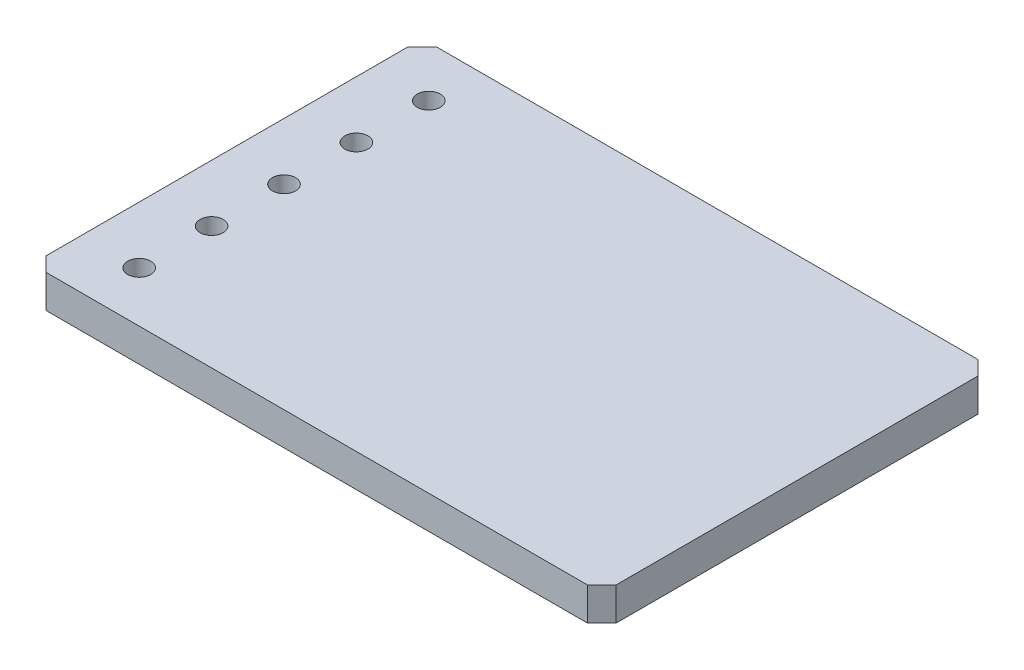
ISO-10303-21;
HEADER;
FILE_DESCRIPTION(('STEP AP214'),'2;1');
FILE_NAME('part.step','',(''),(''),'','','');
FILE_SCHEMA(('AUTOMOTIVE_DESIGN { 1 0 10303 214 1 1 1 1 }'));
ENDSEC;
DATA;
#1=APPLICATION_CONTEXT('core data for automotive mechanical design processes');
#2=APPLICATION_PROTOCOL_DEFINITION('international standard','automotive_design',2000,#1);
#3=PRODUCT_CONTEXT('',#1,'mechanical');
#4=PRODUCT('Part','Part','',(#3));
#5=PRODUCT_RELATED_PRODUCT_CATEGORY('part','',(#4));
#6=PRODUCT_DEFINITION_FORMATION('','',#4);
#7=PRODUCT_DEFINITION_CONTEXT('part definition',#1,'design');
#8=PRODUCT_DEFINITION('design','',#6,#7);
#9=PRODUCT_DEFINITION_SHAPE('','',#8);
#10=(LENGTH_UNIT() NAMED_UNIT(*) SI_UNIT(.MILLI.,.METRE.));
#11=(NAMED_UNIT(*) PLANE_ANGLE_UNIT() SI_UNIT($,.RADIAN.));
#12=(NAMED_UNIT(*) SI_UNIT($,.STERADIAN.) SOLID_ANGLE_UNIT());
#13=UNCERTAINTY_MEASURE_WITH_UNIT(LENGTH_MEASURE(1.E-05),#10,'distance_accuracy_value','');
#14=(GEOMETRIC_REPRESENTATION_CONTEXT(3) GLOBAL_UNCERTAINTY_ASSIGNED_CONTEXT((#13)) GLOBAL_UNIT_ASSIGNED_CONTEXT((#10,
#11,#12)) REPRESENTATION_CONTEXT('',''));
#15=CARTESIAN_POINT('',(0.,0.,0.));
#16=DIRECTION('',(0.,0.,1.));
#17=DIRECTION('',(1.,0.,0.));
#18=AXIS2_PLACEMENT_3D('',#15,#16,#17);
#19=CARTESIAN_POINT('',(-10.,1.16,0.));
#20=DIRECTION('',(-1.,0.,0.));
#21=DIRECTION('',(0.,0.,1.));
#22=AXIS2_PLACEMENT_3D('',#19,#20,#21);
#23=PLANE('',#22);
#24=DIRECTION('',(0.,0.,-1.));
#25=VECTOR('',#24,1.);
#26=CARTESIAN_POINT('',(-10.,1.16,0.));
#27=LINE('',#26,#25);
#28=CARTESIAN_POINT('',(-10.,1.16,6.35));
#29=VERTEX_POINT('',#28);
#30=CARTESIAN_POINT('',(-10.,1.16,-6.35));
#31=VERTEX_POINT('',#30);
#32=EDGE_CURVE('E188',#29,#31,#27,.T.);
#33=ORIENTED_EDGE('',*,*,#32,.T.);
#34=DIRECTION('',(0.,-1.,0.));
#35=VECTOR('',#34,1.);
#36=CARTESIAN_POINT('',(-10.,0.,-6.35));
#37=LINE('',#36,#35);
#38=CARTESIAN_POINT('',(-10.,0.,-6.35));
#39=VERTEX_POINT('',#38);
#40=EDGE_CURVE('E125',#31,#39,#37,.T.);
#41=ORIENTED_EDGE('',*,*,#40,.T.);
#42=DIRECTION('',(0.,0.,-1.));
#43=VECTOR('',#42,1.);
#44=CARTESIAN_POINT('',(-10.,0.,0.));
#45=LINE('',#44,#43);
#46=CARTESIAN_POINT('',(-10.,0.,6.35));
#47=VERTEX_POINT('',#46);
#48=EDGE_CURVE('E116',#47,#39,#45,.T.);
#49=ORIENTED_EDGE('',*,*,#48,.F.);
#50=DIRECTION('',(0.,1.,0.));
#51=VECTOR('',#50,1.);
#52=CARTESIAN_POINT('',(-10.,1.16,6.35));
#53=LINE('',#52,#51);
#54=EDGE_CURVE('E130',#47,#29,#53,.T.);
#55=ORIENTED_EDGE('',*,*,#54,.T.);
#56=EDGE_LOOP('',(#33,#41,#49,#55));
#57=FACE_BOUND('',#56,.T.);
#58=ADVANCED_FACE('F45',(#57),#23,.T.);
#59=CARTESIAN_POINT('',(0.,1.16,6.85));
#60=DIRECTION('',(0.,0.,1.));
#61=DIRECTION('',(1.,0.,0.));
#62=AXIS2_PLACEMENT_3D('',#59,#60,#61);
#63=PLANE('',#62);
#64=DIRECTION('',(-1.,0.,0.));
#65=VECTOR('',#64,1.);
#66=CARTESIAN_POINT('',(0.,0.,6.85));
#67=LINE('',#66,#65);
#68=CARTESIAN_POINT('',(9.5,0.,6.85));
#69=VERTEX_POINT('',#68);
#70=CARTESIAN_POINT('',(-9.5,0.,6.85));
#71=VERTEX_POINT('',#70);
#72=EDGE_CURVE('E118',#69,#71,#67,.T.);
#73=ORIENTED_EDGE('',*,*,#72,.F.);
#74=DIRECTION('',(0.,1.,0.));
#75=VECTOR('',#74,1.);
#76=CARTESIAN_POINT('',(9.5,1.16,6.85));
#77=LINE('',#76,#75);
#78=CARTESIAN_POINT('',(9.5,1.16,6.85));
#79=VERTEX_POINT('',#78);
#80=EDGE_CURVE('E11',#69,#79,#77,.T.);
#81=ORIENTED_EDGE('',*,*,#80,.T.);
#82=DIRECTION('',(-1.,0.,0.));
#83=VECTOR('',#82,1.);
#84=CARTESIAN_POINT('',(0.,1.16,6.85));
#85=LINE('',#84,#83);
#86=CARTESIAN_POINT('',(-9.5,1.16,6.85));
#87=VERTEX_POINT('',#86);
#88=EDGE_CURVE('E186',#79,#87,#85,.T.);
#89=ORIENTED_EDGE('',*,*,#88,.T.);
#90=DIRECTION('',(0.,-1.,0.));
#91=VECTOR('',#90,1.);
#92=CARTESIAN_POINT('',(-9.5,1.16,6.85));
#93=LINE('',#92,#91);
#94=EDGE_CURVE('E55',#87,#71,#93,.T.);
#95=ORIENTED_EDGE('',*,*,#94,.T.);
#96=EDGE_LOOP('',(#73,#81,#89,#95));
#97=FACE_BOUND('',#96,.T.);
#98=ADVANCED_FACE('F184',(#97),#63,.T.);
#99=CARTESIAN_POINT('',(10.,1.16,0.));
#100=DIRECTION('',(-1.,0.,0.));
#101=DIRECTION('',(0.,0.,1.));
#102=AXIS2_PLACEMENT_3D('',#99,#100,#101);
#103=PLANE('',#102);
#104=DIRECTION('',(0.,0.,-1.));
#105=VECTOR('',#104,1.);
#106=CARTESIAN_POINT('',(10.,0.,0.));
#107=LINE('',#106,#105);
#108=CARTESIAN_POINT('',(10.,0.,6.35));
#109=VERTEX_POINT('',#108);
#110=CARTESIAN_POINT('',(10.,0.,-6.35));
#111=VERTEX_POINT('',#110);
#112=EDGE_CURVE('E217',#109,#111,#107,.T.);
#113=ORIENTED_EDGE('',*,*,#112,.T.);
#114=DIRECTION('',(0.,1.,0.));
#115=VECTOR('',#114,1.);
#116=CARTESIAN_POINT('',(10.,1.16,-6.35));
#117=LINE('',#116,#115);
#118=CARTESIAN_POINT('',(10.,1.16,-6.35));
#119=VERTEX_POINT('',#118);
#120=EDGE_CURVE('E62',#111,#119,#117,.T.);
#121=ORIENTED_EDGE('',*,*,#120,.T.);
#122=DIRECTION('',(0.,0.,-1.));
#123=VECTOR('',#122,1.);
#124=CARTESIAN_POINT('',(10.,1.16,0.));
#125=LINE('',#124,#123);
#126=CARTESIAN_POINT('',(10.,1.16,6.35));
#127=VERTEX_POINT('',#126);
#128=EDGE_CURVE('E145',#127,#119,#125,.T.);
#129=ORIENTED_EDGE('',*,*,#128,.F.);
#130=DIRECTION('',(0.,-1.,0.));
#131=VECTOR('',#130,1.);
#132=CARTESIAN_POINT('',(10.,0.,6.35));
#133=LINE('',#132,#131);
#134=EDGE_CURVE('E176',#127,#109,#133,.T.);
#135=ORIENTED_EDGE('',*,*,#134,.T.);
#136=EDGE_LOOP('',(#113,#121,#129,#135));
#137=FACE_BOUND('',#136,.T.);
#138=ADVANCED_FACE('F278',(#137),#103,.F.);
#139=CARTESIAN_POINT('',(-8.,1.16,0.));
#140=DIRECTION('',(0.,-1.,0.));
#141=DIRECTION('',(0.,0.,-1.));
#142=AXIS2_PLACEMENT_3D('',#139,#140,#141);
#143=CYLINDRICAL_SURFACE('',#142,0.405);
#144=CARTESIAN_POINT('',(-8.,1.16,0.));
#145=DIRECTION('',(0.,1.,0.));
#146=DIRECTION('',(0.,0.,1.));
#147=AXIS2_PLACEMENT_3D('',#144,#145,#146);
#148=CIRCLE('',#147,0.405);
#149=CARTESIAN_POINT('',(-8.,1.16,0.405000000000001));
#150=VERTEX_POINT('',#149);
#151=EDGE_CURVE('E193',#150,#150,#148,.T.);
#152=ORIENTED_EDGE('',*,*,#151,.T.);
#153=EDGE_LOOP('',(#152));
#154=FACE_BOUND('',#153,.T.);
#155=CARTESIAN_POINT('',(-8.,0.,0.));
#156=DIRECTION('',(0.,1.,0.));
#157=DIRECTION('',(0.,0.,1.));
#158=AXIS2_PLACEMENT_3D('',#155,#156,#157);
#159=CIRCLE('',#158,0.405);
#160=CARTESIAN_POINT('',(-8.,0.,0.405000000000001));
#161=VERTEX_POINT('',#160);
#162=EDGE_CURVE('E134',#161,#161,#159,.T.);
#163=ORIENTED_EDGE('',*,*,#162,.F.);
#164=EDGE_LOOP('',(#163));
#165=FACE_BOUND('',#164,.T.);
#166=ADVANCED_FACE('F247',(#154,#165),#143,.F.);
#167=CARTESIAN_POINT('',(-8.00000000000001,1.16,-2.54));
#168=DIRECTION('',(0.,-1.,0.));
#169=DIRECTION('',(0.,0.,-1.));
#170=AXIS2_PLACEMENT_3D('',#167,#168,#169);
#171=CYLINDRICAL_SURFACE('',#170,0.405);
#172=CARTESIAN_POINT('',(-8.00000000000001,1.16,-2.54));
#173=DIRECTION('',(0.,1.,0.));
#174=DIRECTION('',(0.,0.,1.));
#175=AXIS2_PLACEMENT_3D('',#172,#173,#174);
#176=CIRCLE('',#175,0.405);
#177=CARTESIAN_POINT('',(-8.00000000000001,1.16,-2.135));
#178=VERTEX_POINT('',#177);
#179=EDGE_CURVE('E240',#178,#178,#176,.T.);
#180=ORIENTED_EDGE('',*,*,#179,.T.);
#181=EDGE_LOOP('',(#180));
#182=FACE_BOUND('',#181,.T.);
#183=CARTESIAN_POINT('',(-8.00000000000001,0.,-2.54));
#184=DIRECTION('',(0.,1.,0.));
#185=DIRECTION('',(0.,0.,1.));
#186=AXIS2_PLACEMENT_3D('',#183,#184,#185);
#187=CIRCLE('',#186,0.405);
#188=CARTESIAN_POINT('',(-8.00000000000001,0.,-2.135));
#189=VERTEX_POINT('',#188);
#190=EDGE_CURVE('E209',#189,#189,#187,.T.);
#191=ORIENTED_EDGE('',*,*,#190,.F.);
#192=EDGE_LOOP('',(#191));
#193=FACE_BOUND('',#192,.T.);
#194=ADVANCED_FACE('F283',(#182,#193),#171,.F.);
#195=CARTESIAN_POINT('',(-8.00000000000002,1.16,-5.08));
#196=DIRECTION('',(0.,-1.,0.));
#197=DIRECTION('',(0.,0.,-1.));
#198=AXIS2_PLACEMENT_3D('',#195,#196,#197);
#199=CYLINDRICAL_SURFACE('',#198,0.405);
#200=CARTESIAN_POINT('',(-8.00000000000002,1.16,-5.08));
#201=DIRECTION('',(0.,1.,0.));
#202=DIRECTION('',(0.,0.,1.));
#203=AXIS2_PLACEMENT_3D('',#200,#201,#202);
#204=CIRCLE('',#203,0.405);
#205=CARTESIAN_POINT('',(-8.00000000000002,1.16,-4.675));
#206=VERTEX_POINT('',#205);
#207=EDGE_CURVE('E234',#206,#206,#204,.T.);
#208=ORIENTED_EDGE('',*,*,#207,.T.);
#209=EDGE_LOOP('',(#208));
#210=FACE_BOUND('',#209,.T.);
#211=CARTESIAN_POINT('',(-8.00000000000002,0.,-5.08));
#212=DIRECTION('',(0.,1.,0.));
#213=DIRECTION('',(0.,0.,1.));
#214=AXIS2_PLACEMENT_3D('',#211,#212,#213);
#215=CIRCLE('',#214,0.405);
#216=CARTESIAN_POINT('',(-8.00000000000002,0.,-4.675));
#217=VERTEX_POINT('',#216);
#218=EDGE_CURVE('E205',#217,#217,#215,.T.);
#219=ORIENTED_EDGE('',*,*,#218,.F.);
#220=EDGE_LOOP('',(#219));
#221=FACE_BOUND('',#220,.T.);
#222=ADVANCED_FACE('F286',(#210,#221),#199,.F.);
#223=CARTESIAN_POINT('',(-7.99999999999997,1.16,2.54));
#224=DIRECTION('',(0.,-1.,0.));
#225=DIRECTION('',(0.,0.,-1.));
#226=AXIS2_PLACEMENT_3D('',#223,#224,#225);
#227=CYLINDRICAL_SURFACE('',#226,0.405);
#228=CARTESIAN_POINT('',(-7.99999999999997,1.16,2.54));
#229=DIRECTION('',(0.,1.,0.));
#230=DIRECTION('',(0.,0.,1.));
#231=AXIS2_PLACEMENT_3D('',#228,#229,#230);
#232=CIRCLE('',#231,0.405);
#233=CARTESIAN_POINT('',(-7.99999999999997,1.16,2.945));
#234=VERTEX_POINT('',#233);
#235=EDGE_CURVE('E228',#234,#234,#232,.T.);
#236=ORIENTED_EDGE('',*,*,#235,.T.);
#237=EDGE_LOOP('',(#236));
#238=FACE_BOUND('',#237,.T.);
#239=CARTESIAN_POINT('',(-7.99999999999997,0.,2.54));
#240=DIRECTION('',(0.,1.,0.));
#241=DIRECTION('',(0.,0.,1.));
#242=AXIS2_PLACEMENT_3D('',#239,#240,#241);
#243=CIRCLE('',#242,0.405);
#244=CARTESIAN_POINT('',(-7.99999999999997,0.,2.945));
#245=VERTEX_POINT('',#244);
#246=EDGE_CURVE('E201',#245,#245,#243,.T.);
#247=ORIENTED_EDGE('',*,*,#246,.F.);
#248=EDGE_LOOP('',(#247));
#249=FACE_BOUND('',#248,.T.);
#250=ADVANCED_FACE('F269',(#238,#249),#227,.F.);
#251=CARTESIAN_POINT('',(-7.99999999999995,1.16,5.08));
#252=DIRECTION('',(0.,-1.,0.));
#253=DIRECTION('',(0.,0.,-1.));
#254=AXIS2_PLACEMENT_3D('',#251,#252,#253);
#255=CYLINDRICAL_SURFACE('',#254,0.405);
#256=CARTESIAN_POINT('',(-7.99999999999995,1.16,5.08));
#257=DIRECTION('',(0.,1.,0.));
#258=DIRECTION('',(0.,0.,1.));
#259=AXIS2_PLACEMENT_3D('',#256,#257,#258);
#260=CIRCLE('',#259,0.405);
#261=CARTESIAN_POINT('',(-7.99999999999995,1.16,5.485));
#262=VERTEX_POINT('',#261);
#263=EDGE_CURVE('E222',#262,#262,#260,.T.);
#264=ORIENTED_EDGE('',*,*,#263,.T.);
#265=EDGE_LOOP('',(#264));
#266=FACE_BOUND('',#265,.T.);
#267=CARTESIAN_POINT('',(-7.99999999999995,0.,5.08));
#268=DIRECTION('',(0.,1.,0.));
#269=DIRECTION('',(0.,0.,1.));
#270=AXIS2_PLACEMENT_3D('',#267,#268,#269);
#271=CIRCLE('',#270,0.405);
#272=CARTESIAN_POINT('',(-7.99999999999995,0.,5.485));
#273=VERTEX_POINT('',#272);
#274=EDGE_CURVE('E197',#273,#273,#271,.T.);
#275=ORIENTED_EDGE('',*,*,#274,.F.);
#276=EDGE_LOOP('',(#275));
#277=FACE_BOUND('',#276,.T.);
#278=ADVANCED_FACE('F264',(#266,#277),#255,.F.);
#279=CARTESIAN_POINT('',(0.,1.16,-6.85));
#280=DIRECTION('',(0.,0.,1.));
#281=DIRECTION('',(1.,0.,0.));
#282=AXIS2_PLACEMENT_3D('',#279,#280,#281);
#283=PLANE('',#282);
#284=DIRECTION('',(-1.,0.,0.));
#285=VECTOR('',#284,1.);
#286=CARTESIAN_POINT('',(0.,0.,-6.85));
#287=LINE('',#286,#285);
#288=CARTESIAN_POINT('',(9.5,0.,-6.85));
#289=VERTEX_POINT('',#288);
#290=CARTESIAN_POINT('',(-9.5,0.,-6.85));
#291=VERTEX_POINT('',#290);
#292=EDGE_CURVE('E148',#289,#291,#287,.T.);
#293=ORIENTED_EDGE('',*,*,#292,.T.);
#294=DIRECTION('',(0.,1.,0.));
#295=VECTOR('',#294,1.);
#296=CARTESIAN_POINT('',(-9.5,1.16,-6.85));
#297=LINE('',#296,#295);
#298=CARTESIAN_POINT('',(-9.5,1.16,-6.85));
#299=VERTEX_POINT('',#298);
#300=EDGE_CURVE('E163',#291,#299,#297,.T.);
#301=ORIENTED_EDGE('',*,*,#300,.T.);
#302=DIRECTION('',(-1.,0.,0.));
#303=VECTOR('',#302,1.);
#304=CARTESIAN_POINT('',(0.,1.16,-6.85));
#305=LINE('',#304,#303);
#306=CARTESIAN_POINT('',(9.5,1.16,-6.85));
#307=VERTEX_POINT('',#306);
#308=EDGE_CURVE('E139',#307,#299,#305,.T.);
#309=ORIENTED_EDGE('',*,*,#308,.F.);
#310=DIRECTION('',(0.,-1.,0.));
#311=VECTOR('',#310,1.);
#312=CARTESIAN_POINT('',(9.5,1.16,-6.85));
#313=LINE('',#312,#311);
#314=EDGE_CURVE('E159',#307,#289,#313,.T.);
#315=ORIENTED_EDGE('',*,*,#314,.T.);
#316=EDGE_LOOP('',(#293,#301,#309,#315));
#317=FACE_BOUND('',#316,.T.);
#318=ADVANCED_FACE('F252',(#317),#283,.F.);
#319=CARTESIAN_POINT('',(0.,1.16,0.));
#320=DIRECTION('',(0.,1.,0.));
#321=DIRECTION('',(0.,0.,1.));
#322=AXIS2_PLACEMENT_3D('',#319,#320,#321);
#323=PLANE('',#322);
#324=ORIENTED_EDGE('',*,*,#263,.F.);
#325=EDGE_LOOP('',(#324));
#326=FACE_BOUND('',#325,.T.);
#327=ORIENTED_EDGE('',*,*,#235,.F.);
#328=EDGE_LOOP('',(#327));
#329=FACE_BOUND('',#328,.T.);
#330=ORIENTED_EDGE('',*,*,#207,.F.);
#331=EDGE_LOOP('',(#330));
#332=FACE_BOUND('',#331,.T.);
#333=ORIENTED_EDGE('',*,*,#179,.F.);
#334=EDGE_LOOP('',(#333));
#335=FACE_BOUND('',#334,.T.);
#336=ORIENTED_EDGE('',*,*,#151,.F.);
#337=EDGE_LOOP('',(#336));
#338=FACE_BOUND('',#337,.T.);
#339=ORIENTED_EDGE('',*,*,#308,.T.);
#340=DIRECTION('',(-0.70710678118655,0.,0.707106781186545));
#341=VECTOR('',#340,1.);
#342=CARTESIAN_POINT('',(-8.17499999999997,1.16,-8.17500000000002));
#343=LINE('',#342,#341);
#344=EDGE_CURVE('E173',#299,#31,#343,.T.);
#345=ORIENTED_EDGE('',*,*,#344,.T.);
#346=ORIENTED_EDGE('',*,*,#32,.F.);
#347=DIRECTION('',(-0.707106781186544,0.,-0.707106781186551));
#348=VECTOR('',#347,1.);
#349=CARTESIAN_POINT('',(-8.17500000000004,1.16,8.17499999999997));
#350=LINE('',#349,#348);
#351=EDGE_CURVE('E137',#29,#87,#350,.F.);
#352=ORIENTED_EDGE('',*,*,#351,.T.);
#353=ORIENTED_EDGE('',*,*,#88,.F.);
#354=DIRECTION('',(0.70710678118655,0.,-0.707106781186545));
#355=VECTOR('',#354,1.);
#356=CARTESIAN_POINT('',(8.17499999999997,1.16,8.17500000000002));
#357=LINE('',#356,#355);
#358=EDGE_CURVE('E69',#79,#127,#357,.T.);
#359=ORIENTED_EDGE('',*,*,#358,.T.);
#360=ORIENTED_EDGE('',*,*,#128,.T.);
#361=DIRECTION('',(0.707106781186545,0.,0.70710678118655));
#362=VECTOR('',#361,1.);
#363=CARTESIAN_POINT('',(8.17500000000003,1.16,-8.17499999999998));
#364=LINE('',#363,#362);
#365=EDGE_CURVE('E170',#119,#307,#364,.F.);
#366=ORIENTED_EDGE('',*,*,#365,.T.);
#367=EDGE_LOOP('',(#339,#345,#346,#352,#353,#359,#360,#366));
#368=FACE_BOUND('',#367,.T.);
#369=ADVANCED_FACE('F250',(#326,#329,#332,#335,#338,#368),#323,.T.);
#370=CARTESIAN_POINT('',(0.,0.,0.));
#371=DIRECTION('',(0.,1.,0.));
#372=DIRECTION('',(0.,0.,1.));
#373=AXIS2_PLACEMENT_3D('',#370,#371,#372);
#374=PLANE('',#373);
#375=ORIENTED_EDGE('',*,*,#274,.T.);
#376=EDGE_LOOP('',(#375));
#377=FACE_BOUND('',#376,.T.);
#378=ORIENTED_EDGE('',*,*,#246,.T.);
#379=EDGE_LOOP('',(#378));
#380=FACE_BOUND('',#379,.T.);
#381=ORIENTED_EDGE('',*,*,#218,.T.);
#382=EDGE_LOOP('',(#381));
#383=FACE_BOUND('',#382,.T.);
#384=ORIENTED_EDGE('',*,*,#190,.T.);
#385=EDGE_LOOP('',(#384));
#386=FACE_BOUND('',#385,.T.);
#387=ORIENTED_EDGE('',*,*,#162,.T.);
#388=EDGE_LOOP('',(#387));
#389=FACE_BOUND('',#388,.T.);
#390=ORIENTED_EDGE('',*,*,#48,.T.);
#391=DIRECTION('',(0.70710678118655,0.,-0.707106781186545));
#392=VECTOR('',#391,1.);
#393=CARTESIAN_POINT('',(-10.,0.,-6.35));
#394=LINE('',#393,#392);
#395=EDGE_CURVE('E156',#39,#291,#394,.T.);
#396=ORIENTED_EDGE('',*,*,#395,.T.);
#397=ORIENTED_EDGE('',*,*,#292,.F.);
#398=DIRECTION('',(-0.707106781186545,0.,-0.70710678118655));
#399=VECTOR('',#398,1.);
#400=CARTESIAN_POINT('',(9.5,0.,-6.85));
#401=LINE('',#400,#399);
#402=EDGE_CURVE('E153',#289,#111,#401,.F.);
#403=ORIENTED_EDGE('',*,*,#402,.T.);
#404=ORIENTED_EDGE('',*,*,#112,.F.);
#405=DIRECTION('',(-0.70710678118655,0.,0.707106781186545));
#406=VECTOR('',#405,1.);
#407=CARTESIAN_POINT('',(10.,0.,6.35));
#408=LINE('',#407,#406);
#409=EDGE_CURVE('E124',#109,#69,#408,.T.);
#410=ORIENTED_EDGE('',*,*,#409,.T.);
#411=ORIENTED_EDGE('',*,*,#72,.T.);
#412=DIRECTION('',(0.707106781186544,0.,0.707106781186551));
#413=VECTOR('',#412,1.);
#414=CARTESIAN_POINT('',(-9.5,0.,6.85));
#415=LINE('',#414,#413);
#416=EDGE_CURVE('E113',#71,#47,#415,.F.);
#417=ORIENTED_EDGE('',*,*,#416,.T.);
#418=EDGE_LOOP('',(#390,#396,#397,#403,#404,#410,#411,#417));
#419=FACE_BOUND('',#418,.T.);
#420=ADVANCED_FACE('F115',(#377,#380,#383,#386,#389,#419),#374,.F.);
#421=CARTESIAN_POINT('',(-10.,1.16,-6.35));
#422=DIRECTION('',(-0.707106781186545,0.,-0.70710678118655));
#423=DIRECTION('',(0.,1.,0.));
#424=AXIS2_PLACEMENT_3D('',#421,#422,#423);
#425=PLANE('',#424);
#426=ORIENTED_EDGE('',*,*,#344,.F.);
#427=ORIENTED_EDGE('',*,*,#300,.F.);
#428=ORIENTED_EDGE('',*,*,#395,.F.);
#429=ORIENTED_EDGE('',*,*,#40,.F.);
#430=EDGE_LOOP('',(#426,#427,#428,#429));
#431=FACE_BOUND('',#430,.T.);
#432=ADVANCED_FACE('F260',(#431),#425,.T.);
#433=CARTESIAN_POINT('',(9.5,1.16,-6.85));
#434=DIRECTION('',(-0.70710678118655,0.,0.707106781186545));
#435=DIRECTION('',(0.,-1.,0.));
#436=AXIS2_PLACEMENT_3D('',#433,#434,#435);
#437=PLANE('',#436);
#438=ORIENTED_EDGE('',*,*,#365,.F.);
#439=ORIENTED_EDGE('',*,*,#120,.F.);
#440=ORIENTED_EDGE('',*,*,#402,.F.);
#441=ORIENTED_EDGE('',*,*,#314,.F.);
#442=EDGE_LOOP('',(#438,#439,#440,#441));
#443=FACE_BOUND('',#442,.T.);
#444=ADVANCED_FACE('F262',(#443),#437,.F.);
#445=CARTESIAN_POINT('',(10.,1.16,6.35));
#446=DIRECTION('',(0.707106781186545,0.,0.70710678118655));
#447=DIRECTION('',(0.,1.,0.));
#448=AXIS2_PLACEMENT_3D('',#445,#446,#447);
#449=PLANE('',#448);
#450=ORIENTED_EDGE('',*,*,#358,.F.);
#451=ORIENTED_EDGE('',*,*,#80,.F.);
#452=ORIENTED_EDGE('',*,*,#409,.F.);
#453=ORIENTED_EDGE('',*,*,#134,.F.);
#454=EDGE_LOOP('',(#450,#451,#452,#453));
#455=FACE_BOUND('',#454,.T.);
#456=ADVANCED_FACE('F304',(#455),#449,.T.);
#457=CARTESIAN_POINT('',(-9.5,1.16,6.85));
#458=DIRECTION('',(0.707106781186551,0.,-0.707106781186544));
#459=DIRECTION('',(0.,-1.,0.));
#460=AXIS2_PLACEMENT_3D('',#457,#458,#459);
#461=PLANE('',#460);
#462=ORIENTED_EDGE('',*,*,#351,.F.);
#463=ORIENTED_EDGE('',*,*,#54,.F.);
#464=ORIENTED_EDGE('',*,*,#416,.F.);
#465=ORIENTED_EDGE('',*,*,#94,.F.);
#466=EDGE_LOOP('',(#462,#463,#464,#465));
#467=FACE_BOUND('',#466,.T.);
#468=ADVANCED_FACE('F48',(#467),#461,.F.);
#469=CLOSED_SHELL('',(#58,#98,#138,#166,#194,#222,#250,#278,#318,#369,#420,#432,#444,#456,#468));
#470=MANIFOLD_SOLID_BREP('B2',#469);
#471=ADVANCED_BREP_SHAPE_REPRESENTATION('',(#18,#470),#14);
#472=SHAPE_DEFINITION_REPRESENTATION(#9,#471);
ENDSEC;
END-ISO-10303-21;
